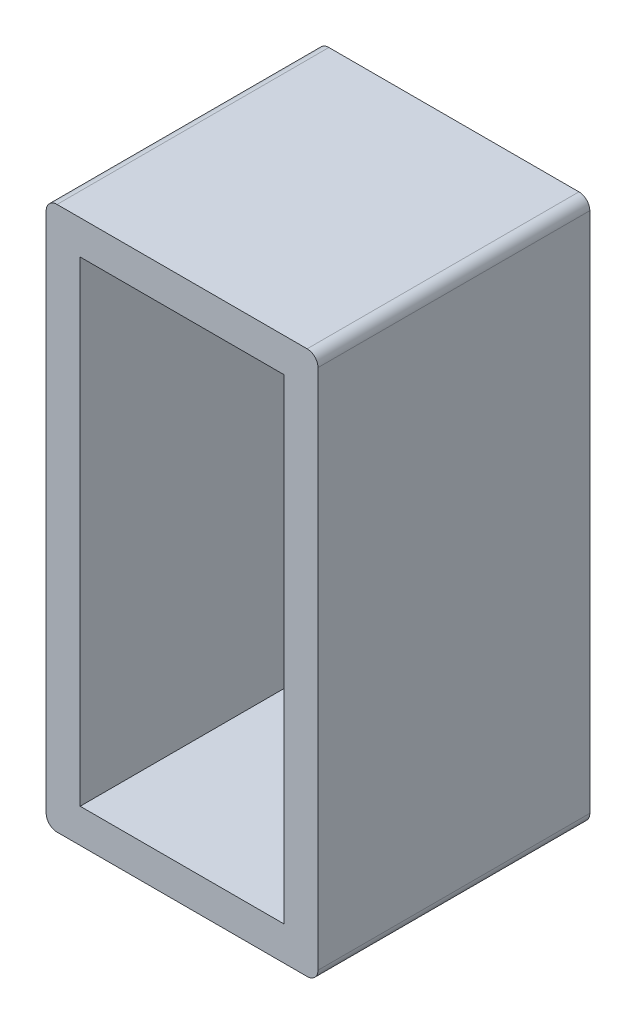
ISO-10303-21;
HEADER;
FILE_DESCRIPTION(('STEP AP214'),'2;1');
FILE_NAME('part.step','',(''),(''),'','','');
FILE_SCHEMA(('AUTOMOTIVE_DESIGN { 1 0 10303 214 1 1 1 1 }'));
ENDSEC;
DATA;
#1=APPLICATION_CONTEXT('core data for automotive mechanical design processes');
#2=APPLICATION_PROTOCOL_DEFINITION('international standard','automotive_design',2000,#1);
#3=PRODUCT_CONTEXT('',#1,'mechanical');
#4=PRODUCT('Part','Part','',(#3));
#5=PRODUCT_RELATED_PRODUCT_CATEGORY('part','',(#4));
#6=PRODUCT_DEFINITION_FORMATION('','',#4);
#7=PRODUCT_DEFINITION_CONTEXT('part definition',#1,'design');
#8=PRODUCT_DEFINITION('design','',#6,#7);
#9=PRODUCT_DEFINITION_SHAPE('','',#8);
#10=(LENGTH_UNIT() NAMED_UNIT(*) SI_UNIT(.MILLI.,.METRE.));
#11=(NAMED_UNIT(*) PLANE_ANGLE_UNIT() SI_UNIT($,.RADIAN.));
#12=(NAMED_UNIT(*) SI_UNIT($,.STERADIAN.) SOLID_ANGLE_UNIT());
#13=UNCERTAINTY_MEASURE_WITH_UNIT(LENGTH_MEASURE(1.E-05),#10,'distance_accuracy_value','');
#14=(GEOMETRIC_REPRESENTATION_CONTEXT(3) GLOBAL_UNCERTAINTY_ASSIGNED_CONTEXT((#13)) GLOBAL_UNIT_ASSIGNED_CONTEXT((#10,
#11,#12)) REPRESENTATION_CONTEXT('',''));
#15=CARTESIAN_POINT('',(0.,0.,0.));
#16=DIRECTION('',(0.,0.,1.));
#17=DIRECTION('',(1.,0.,0.));
#18=AXIS2_PLACEMENT_3D('',#15,#16,#17);
#19=CARTESIAN_POINT('',(-11.684,-24.384,12.7));
#20=DIRECTION('',(0.,0.,1.));
#21=DIRECTION('',(1.,0.,0.));
#22=AXIS2_PLACEMENT_3D('',#19,#20,#21);
#23=PLANE('',#22);
#24=CARTESIAN_POINT('',(-11.684,-24.384,12.7));
#25=DIRECTION('',(0.,0.,1.));
#26=DIRECTION('',(1.,0.,0.));
#27=AXIS2_PLACEMENT_3D('',#24,#25,#26);
#28=CIRCLE('',#27,1.016);
#29=CARTESIAN_POINT('',(-12.7,-24.384,12.7));
#30=VERTEX_POINT('',#29);
#31=CARTESIAN_POINT('',(-11.684,-25.4,12.7));
#32=VERTEX_POINT('',#31);
#33=EDGE_CURVE('E157',#30,#32,#28,.T.);
#34=ORIENTED_EDGE('',*,*,#33,.T.);
#35=DIRECTION('',(1.,0.,0.));
#36=VECTOR('',#35,1.);
#37=CARTESIAN_POINT('',(-11.684,-25.4,12.7));
#38=LINE('',#37,#36);
#39=CARTESIAN_POINT('',(11.684,-25.4,12.7));
#40=VERTEX_POINT('',#39);
#41=EDGE_CURVE('E160',#32,#40,#38,.T.);
#42=ORIENTED_EDGE('',*,*,#41,.T.);
#43=CARTESIAN_POINT('',(11.684,-24.384,12.7));
#44=DIRECTION('',(0.,0.,1.));
#45=DIRECTION('',(1.,0.,0.));
#46=AXIS2_PLACEMENT_3D('',#43,#44,#45);
#47=CIRCLE('',#46,1.016);
#48=CARTESIAN_POINT('',(12.7,-24.384,12.7));
#49=VERTEX_POINT('',#48);
#50=EDGE_CURVE('E163',#40,#49,#47,.T.);
#51=ORIENTED_EDGE('',*,*,#50,.T.);
#52=DIRECTION('',(0.,1.,0.));
#53=VECTOR('',#52,1.);
#54=CARTESIAN_POINT('',(12.7,-24.384,12.7));
#55=LINE('',#54,#53);
#56=CARTESIAN_POINT('',(12.7,24.384,12.7));
#57=VERTEX_POINT('',#56);
#58=EDGE_CURVE('E165',#49,#57,#55,.T.);
#59=ORIENTED_EDGE('',*,*,#58,.T.);
#60=CARTESIAN_POINT('',(11.684,24.384,12.7));
#61=DIRECTION('',(0.,0.,1.));
#62=DIRECTION('',(1.,0.,0.));
#63=AXIS2_PLACEMENT_3D('',#60,#61,#62);
#64=CIRCLE('',#63,1.016);
#65=CARTESIAN_POINT('',(11.684,25.4,12.7));
#66=VERTEX_POINT('',#65);
#67=EDGE_CURVE('E167',#57,#66,#64,.T.);
#68=ORIENTED_EDGE('',*,*,#67,.T.);
#69=DIRECTION('',(-1.,0.,0.));
#70=VECTOR('',#69,1.);
#71=CARTESIAN_POINT('',(-11.684,25.4,12.7));
#72=LINE('',#71,#70);
#73=CARTESIAN_POINT('',(-11.684,25.4,12.7));
#74=VERTEX_POINT('',#73);
#75=EDGE_CURVE('E169',#66,#74,#72,.T.);
#76=ORIENTED_EDGE('',*,*,#75,.T.);
#77=CARTESIAN_POINT('',(-11.684,24.384,12.7));
#78=DIRECTION('',(0.,0.,1.));
#79=DIRECTION('',(1.,0.,0.));
#80=AXIS2_PLACEMENT_3D('',#77,#78,#79);
#81=CIRCLE('',#80,1.016);
#82=CARTESIAN_POINT('',(-12.7,24.384,12.7));
#83=VERTEX_POINT('',#82);
#84=EDGE_CURVE('E171',#74,#83,#81,.T.);
#85=ORIENTED_EDGE('',*,*,#84,.T.);
#86=DIRECTION('',(0.,-1.,0.));
#87=VECTOR('',#86,1.);
#88=CARTESIAN_POINT('',(-12.7,-24.384,12.7));
#89=LINE('',#88,#87);
#90=EDGE_CURVE('E173',#83,#30,#89,.T.);
#91=ORIENTED_EDGE('',*,*,#90,.T.);
#92=EDGE_LOOP('',(#34,#42,#51,#59,#68,#76,#85,#91));
#93=FACE_BOUND('',#92,.T.);
#94=DIRECTION('',(1.,0.,0.));
#95=VECTOR('',#94,1.);
#96=CARTESIAN_POINT('',(-9.525,-22.225,12.7));
#97=LINE('',#96,#95);
#98=CARTESIAN_POINT('',(-9.525,-22.225,12.7));
#99=VERTEX_POINT('',#98);
#100=CARTESIAN_POINT('',(9.525,-22.225,12.7));
#101=VERTEX_POINT('',#100);
#102=EDGE_CURVE('E129',#99,#101,#97,.T.);
#103=ORIENTED_EDGE('',*,*,#102,.F.);
#104=DIRECTION('',(0.,-1.,0.));
#105=VECTOR('',#104,1.);
#106=CARTESIAN_POINT('',(-9.525,-22.225,12.7));
#107=LINE('',#106,#105);
#108=CARTESIAN_POINT('',(-9.525,22.225,12.7));
#109=VERTEX_POINT('',#108);
#110=EDGE_CURVE('E121',#109,#99,#107,.T.);
#111=ORIENTED_EDGE('',*,*,#110,.F.);
#112=DIRECTION('',(-1.,0.,0.));
#113=VECTOR('',#112,1.);
#114=CARTESIAN_POINT('',(-9.525,22.225,12.7));
#115=LINE('',#114,#113);
#116=CARTESIAN_POINT('',(9.525,22.225,12.7));
#117=VERTEX_POINT('',#116);
#118=EDGE_CURVE('E143',#117,#109,#115,.T.);
#119=ORIENTED_EDGE('',*,*,#118,.F.);
#120=DIRECTION('',(0.,1.,0.));
#121=VECTOR('',#120,1.);
#122=CARTESIAN_POINT('',(9.525,-22.225,12.7));
#123=LINE('',#122,#121);
#124=EDGE_CURVE('E141',#101,#117,#123,.T.);
#125=ORIENTED_EDGE('',*,*,#124,.F.);
#126=EDGE_LOOP('',(#103,#111,#119,#125));
#127=FACE_BOUND('',#126,.T.);
#128=ADVANCED_FACE('F32',(#93,#127),#23,.T.);
#129=CARTESIAN_POINT('',(-11.684,-24.384,-12.7));
#130=DIRECTION('',(0.,0.,1.));
#131=DIRECTION('',(1.,0.,0.));
#132=AXIS2_PLACEMENT_3D('',#129,#130,#131);
#133=PLANE('',#132);
#134=CARTESIAN_POINT('',(-11.684,-24.384,-12.7));
#135=DIRECTION('',(0.,0.,1.));
#136=DIRECTION('',(1.,0.,0.));
#137=AXIS2_PLACEMENT_3D('',#134,#135,#136);
#138=CIRCLE('',#137,1.016);
#139=CARTESIAN_POINT('',(-12.7,-24.384,-12.7));
#140=VERTEX_POINT('',#139);
#141=CARTESIAN_POINT('',(-11.684,-25.4,-12.7));
#142=VERTEX_POINT('',#141);
#143=EDGE_CURVE('E137',#140,#142,#138,.T.);
#144=ORIENTED_EDGE('',*,*,#143,.F.);
#145=DIRECTION('',(0.,-1.,0.));
#146=VECTOR('',#145,1.);
#147=CARTESIAN_POINT('',(-12.7,-24.384,-12.7));
#148=LINE('',#147,#146);
#149=CARTESIAN_POINT('',(-12.7,24.384,-12.7));
#150=VERTEX_POINT('',#149);
#151=EDGE_CURVE('E161',#150,#140,#148,.T.);
#152=ORIENTED_EDGE('',*,*,#151,.F.);
#153=CARTESIAN_POINT('',(-11.684,24.384,-12.7));
#154=DIRECTION('',(0.,0.,1.));
#155=DIRECTION('',(1.,0.,0.));
#156=AXIS2_PLACEMENT_3D('',#153,#154,#155);
#157=CIRCLE('',#156,1.016);
#158=CARTESIAN_POINT('',(-11.684,25.4,-12.7));
#159=VERTEX_POINT('',#158);
#160=EDGE_CURVE('E188',#159,#150,#157,.T.);
#161=ORIENTED_EDGE('',*,*,#160,.F.);
#162=DIRECTION('',(-1.,0.,0.));
#163=VECTOR('',#162,1.);
#164=CARTESIAN_POINT('',(-11.684,25.4,-12.7));
#165=LINE('',#164,#163);
#166=CARTESIAN_POINT('',(11.684,25.4,-12.7));
#167=VERTEX_POINT('',#166);
#168=EDGE_CURVE('E186',#167,#159,#165,.T.);
#169=ORIENTED_EDGE('',*,*,#168,.F.);
#170=CARTESIAN_POINT('',(11.684,24.384,-12.7));
#171=DIRECTION('',(0.,0.,1.));
#172=DIRECTION('',(1.,0.,0.));
#173=AXIS2_PLACEMENT_3D('',#170,#171,#172);
#174=CIRCLE('',#173,1.016);
#175=CARTESIAN_POINT('',(12.7,24.384,-12.7));
#176=VERTEX_POINT('',#175);
#177=EDGE_CURVE('E184',#176,#167,#174,.T.);
#178=ORIENTED_EDGE('',*,*,#177,.F.);
#179=DIRECTION('',(0.,1.,0.));
#180=VECTOR('',#179,1.);
#181=CARTESIAN_POINT('',(12.7,-24.384,-12.7));
#182=LINE('',#181,#180);
#183=CARTESIAN_POINT('',(12.7,-24.384,-12.7));
#184=VERTEX_POINT('',#183);
#185=EDGE_CURVE('E182',#184,#176,#182,.T.);
#186=ORIENTED_EDGE('',*,*,#185,.F.);
#187=CARTESIAN_POINT('',(11.684,-24.384,-12.7));
#188=DIRECTION('',(0.,0.,1.));
#189=DIRECTION('',(1.,0.,0.));
#190=AXIS2_PLACEMENT_3D('',#187,#188,#189);
#191=CIRCLE('',#190,1.016);
#192=CARTESIAN_POINT('',(11.684,-25.4,-12.7));
#193=VERTEX_POINT('',#192);
#194=EDGE_CURVE('E180',#193,#184,#191,.T.);
#195=ORIENTED_EDGE('',*,*,#194,.F.);
#196=DIRECTION('',(1.,0.,0.));
#197=VECTOR('',#196,1.);
#198=CARTESIAN_POINT('',(-11.684,-25.4,-12.7));
#199=LINE('',#198,#197);
#200=EDGE_CURVE('E178',#142,#193,#199,.T.);
#201=ORIENTED_EDGE('',*,*,#200,.F.);
#202=EDGE_LOOP('',(#144,#152,#161,#169,#178,#186,#195,#201));
#203=FACE_BOUND('',#202,.T.);
#204=DIRECTION('',(0.,-1.,0.));
#205=VECTOR('',#204,1.);
#206=CARTESIAN_POINT('',(-9.525,-22.225,-12.7));
#207=LINE('',#206,#205);
#208=CARTESIAN_POINT('',(-9.525,22.225,-12.7));
#209=VERTEX_POINT('',#208);
#210=CARTESIAN_POINT('',(-9.525,-22.225,-12.7));
#211=VERTEX_POINT('',#210);
#212=EDGE_CURVE('E55',#209,#211,#207,.T.);
#213=ORIENTED_EDGE('',*,*,#212,.T.);
#214=DIRECTION('',(1.,0.,0.));
#215=VECTOR('',#214,1.);
#216=CARTESIAN_POINT('',(-9.525,-22.225,-12.7));
#217=LINE('',#216,#215);
#218=CARTESIAN_POINT('',(9.525,-22.225,-12.7));
#219=VERTEX_POINT('',#218);
#220=EDGE_CURVE('E136',#211,#219,#217,.T.);
#221=ORIENTED_EDGE('',*,*,#220,.T.);
#222=DIRECTION('',(0.,1.,0.));
#223=VECTOR('',#222,1.);
#224=CARTESIAN_POINT('',(9.525,-22.225,-12.7));
#225=LINE('',#224,#223);
#226=CARTESIAN_POINT('',(9.525,22.225,-12.7));
#227=VERTEX_POINT('',#226);
#228=EDGE_CURVE('E149',#219,#227,#225,.T.);
#229=ORIENTED_EDGE('',*,*,#228,.T.);
#230=DIRECTION('',(-1.,0.,0.));
#231=VECTOR('',#230,1.);
#232=CARTESIAN_POINT('',(-9.525,22.225,-12.7));
#233=LINE('',#232,#231);
#234=EDGE_CURVE('E130',#227,#209,#233,.T.);
#235=ORIENTED_EDGE('',*,*,#234,.T.);
#236=EDGE_LOOP('',(#213,#221,#229,#235));
#237=FACE_BOUND('',#236,.T.);
#238=ADVANCED_FACE('F218',(#203,#237),#133,.F.);
#239=CARTESIAN_POINT('',(-11.684,-24.384,12.7));
#240=DIRECTION('',(0.,0.,-1.));
#241=DIRECTION('',(-1.,0.,0.));
#242=AXIS2_PLACEMENT_3D('',#239,#240,#241);
#243=CYLINDRICAL_SURFACE('',#242,1.016);
#244=ORIENTED_EDGE('',*,*,#143,.T.);
#245=DIRECTION('',(0.,0.,-1.));
#246=VECTOR('',#245,1.);
#247=CARTESIAN_POINT('',(-11.684,-25.4,12.7));
#248=LINE('',#247,#246);
#249=EDGE_CURVE('E11',#32,#142,#248,.T.);
#250=ORIENTED_EDGE('',*,*,#249,.F.);
#251=ORIENTED_EDGE('',*,*,#33,.F.);
#252=DIRECTION('',(0.,0.,-1.));
#253=VECTOR('',#252,1.);
#254=CARTESIAN_POINT('',(-12.7,-24.384,12.7));
#255=LINE('',#254,#253);
#256=EDGE_CURVE('E175',#30,#140,#255,.T.);
#257=ORIENTED_EDGE('',*,*,#256,.T.);
#258=EDGE_LOOP('',(#244,#250,#251,#257));
#259=FACE_BOUND('',#258,.T.);
#260=ADVANCED_FACE('F34',(#259),#243,.T.);
#261=CARTESIAN_POINT('',(-11.684,-25.4,12.7));
#262=DIRECTION('',(0.,1.,0.));
#263=DIRECTION('',(0.,0.,1.));
#264=AXIS2_PLACEMENT_3D('',#261,#262,#263);
#265=PLANE('',#264);
#266=ORIENTED_EDGE('',*,*,#200,.T.);
#267=DIRECTION('',(0.,0.,-1.));
#268=VECTOR('',#267,1.);
#269=CARTESIAN_POINT('',(11.684,-25.4,12.7));
#270=LINE('',#269,#268);
#271=EDGE_CURVE('E40',#40,#193,#270,.T.);
#272=ORIENTED_EDGE('',*,*,#271,.F.);
#273=ORIENTED_EDGE('',*,*,#41,.F.);
#274=ORIENTED_EDGE('',*,*,#249,.T.);
#275=EDGE_LOOP('',(#266,#272,#273,#274));
#276=FACE_BOUND('',#275,.T.);
#277=ADVANCED_FACE('F235',(#276),#265,.F.);
#278=CARTESIAN_POINT('',(11.684,-24.384,12.7));
#279=DIRECTION('',(0.,0.,-1.));
#280=DIRECTION('',(-1.,0.,0.));
#281=AXIS2_PLACEMENT_3D('',#278,#279,#280);
#282=CYLINDRICAL_SURFACE('',#281,1.016);
#283=ORIENTED_EDGE('',*,*,#194,.T.);
#284=DIRECTION('',(0.,0.,-1.));
#285=VECTOR('',#284,1.);
#286=CARTESIAN_POINT('',(12.7,-24.384,12.7));
#287=LINE('',#286,#285);
#288=EDGE_CURVE('E205',#49,#184,#287,.T.);
#289=ORIENTED_EDGE('',*,*,#288,.F.);
#290=ORIENTED_EDGE('',*,*,#50,.F.);
#291=ORIENTED_EDGE('',*,*,#271,.T.);
#292=EDGE_LOOP('',(#283,#289,#290,#291));
#293=FACE_BOUND('',#292,.T.);
#294=ADVANCED_FACE('F212',(#293),#282,.T.);
#295=CARTESIAN_POINT('',(12.7,-24.384,12.7));
#296=DIRECTION('',(-1.,0.,0.));
#297=DIRECTION('',(0.,0.,1.));
#298=AXIS2_PLACEMENT_3D('',#295,#296,#297);
#299=PLANE('',#298);
#300=ORIENTED_EDGE('',*,*,#185,.T.);
#301=DIRECTION('',(0.,0.,-1.));
#302=VECTOR('',#301,1.);
#303=CARTESIAN_POINT('',(12.7,24.384,12.7));
#304=LINE('',#303,#302);
#305=EDGE_CURVE('E202',#57,#176,#304,.T.);
#306=ORIENTED_EDGE('',*,*,#305,.F.);
#307=ORIENTED_EDGE('',*,*,#58,.F.);
#308=ORIENTED_EDGE('',*,*,#288,.T.);
#309=EDGE_LOOP('',(#300,#306,#307,#308));
#310=FACE_BOUND('',#309,.T.);
#311=ADVANCED_FACE('F224',(#310),#299,.F.);
#312=CARTESIAN_POINT('',(11.684,24.384,12.7));
#313=DIRECTION('',(0.,0.,-1.));
#314=DIRECTION('',(-1.,0.,0.));
#315=AXIS2_PLACEMENT_3D('',#312,#313,#314);
#316=CYLINDRICAL_SURFACE('',#315,1.016);
#317=ORIENTED_EDGE('',*,*,#177,.T.);
#318=DIRECTION('',(0.,0.,-1.));
#319=VECTOR('',#318,1.);
#320=CARTESIAN_POINT('',(11.684,25.4,12.7));
#321=LINE('',#320,#319);
#322=EDGE_CURVE('E199',#66,#167,#321,.T.);
#323=ORIENTED_EDGE('',*,*,#322,.F.);
#324=ORIENTED_EDGE('',*,*,#67,.F.);
#325=ORIENTED_EDGE('',*,*,#305,.T.);
#326=EDGE_LOOP('',(#317,#323,#324,#325));
#327=FACE_BOUND('',#326,.T.);
#328=ADVANCED_FACE('F228',(#327),#316,.T.);
#329=CARTESIAN_POINT('',(-11.684,25.4,12.7));
#330=DIRECTION('',(0.,-1.,0.));
#331=DIRECTION('',(0.,0.,-1.));
#332=AXIS2_PLACEMENT_3D('',#329,#330,#331);
#333=PLANE('',#332);
#334=ORIENTED_EDGE('',*,*,#168,.T.);
#335=DIRECTION('',(0.,0.,-1.));
#336=VECTOR('',#335,1.);
#337=CARTESIAN_POINT('',(-11.684,25.4,12.7));
#338=LINE('',#337,#336);
#339=EDGE_CURVE('E196',#74,#159,#338,.T.);
#340=ORIENTED_EDGE('',*,*,#339,.F.);
#341=ORIENTED_EDGE('',*,*,#75,.F.);
#342=ORIENTED_EDGE('',*,*,#322,.T.);
#343=EDGE_LOOP('',(#334,#340,#341,#342));
#344=FACE_BOUND('',#343,.T.);
#345=ADVANCED_FACE('F248',(#344),#333,.F.);
#346=CARTESIAN_POINT('',(-11.684,24.384,12.7));
#347=DIRECTION('',(0.,0.,-1.));
#348=DIRECTION('',(-1.,0.,0.));
#349=AXIS2_PLACEMENT_3D('',#346,#347,#348);
#350=CYLINDRICAL_SURFACE('',#349,1.016);
#351=ORIENTED_EDGE('',*,*,#160,.T.);
#352=DIRECTION('',(0.,0.,-1.));
#353=VECTOR('',#352,1.);
#354=CARTESIAN_POINT('',(-12.7,24.384,12.7));
#355=LINE('',#354,#353);
#356=EDGE_CURVE('E193',#83,#150,#355,.T.);
#357=ORIENTED_EDGE('',*,*,#356,.F.);
#358=ORIENTED_EDGE('',*,*,#84,.F.);
#359=ORIENTED_EDGE('',*,*,#339,.T.);
#360=EDGE_LOOP('',(#351,#357,#358,#359));
#361=FACE_BOUND('',#360,.T.);
#362=ADVANCED_FACE('F246',(#361),#350,.T.);
#363=CARTESIAN_POINT('',(-12.7,-24.384,12.7));
#364=DIRECTION('',(1.,0.,0.));
#365=DIRECTION('',(0.,0.,-1.));
#366=AXIS2_PLACEMENT_3D('',#363,#364,#365);
#367=PLANE('',#366);
#368=ORIENTED_EDGE('',*,*,#151,.T.);
#369=ORIENTED_EDGE('',*,*,#256,.F.);
#370=ORIENTED_EDGE('',*,*,#90,.F.);
#371=ORIENTED_EDGE('',*,*,#356,.T.);
#372=EDGE_LOOP('',(#368,#369,#370,#371));
#373=FACE_BOUND('',#372,.T.);
#374=ADVANCED_FACE('F241',(#373),#367,.F.);
#375=CARTESIAN_POINT('',(-9.525,-22.225,12.7));
#376=DIRECTION('',(1.,0.,0.));
#377=DIRECTION('',(0.,0.,-1.));
#378=AXIS2_PLACEMENT_3D('',#375,#376,#377);
#379=PLANE('',#378);
#380=ORIENTED_EDGE('',*,*,#212,.F.);
#381=DIRECTION('',(0.,0.,-1.));
#382=VECTOR('',#381,1.);
#383=CARTESIAN_POINT('',(-9.525,22.225,12.7));
#384=LINE('',#383,#382);
#385=EDGE_CURVE('E125',#109,#209,#384,.T.);
#386=ORIENTED_EDGE('',*,*,#385,.F.);
#387=ORIENTED_EDGE('',*,*,#110,.T.);
#388=DIRECTION('',(0.,0.,-1.));
#389=VECTOR('',#388,1.);
#390=CARTESIAN_POINT('',(-9.525,-22.225,12.7));
#391=LINE('',#390,#389);
#392=EDGE_CURVE('E124',#99,#211,#391,.T.);
#393=ORIENTED_EDGE('',*,*,#392,.T.);
#394=EDGE_LOOP('',(#380,#386,#387,#393));
#395=FACE_BOUND('',#394,.T.);
#396=ADVANCED_FACE('F123',(#395),#379,.T.);
#397=CARTESIAN_POINT('',(-9.525,-22.225,12.7));
#398=DIRECTION('',(0.,1.,0.));
#399=DIRECTION('',(0.,0.,1.));
#400=AXIS2_PLACEMENT_3D('',#397,#398,#399);
#401=PLANE('',#400);
#402=ORIENTED_EDGE('',*,*,#220,.F.);
#403=ORIENTED_EDGE('',*,*,#392,.F.);
#404=ORIENTED_EDGE('',*,*,#102,.T.);
#405=DIRECTION('',(0.,0.,-1.));
#406=VECTOR('',#405,1.);
#407=CARTESIAN_POINT('',(9.525,-22.225,12.7));
#408=LINE('',#407,#406);
#409=EDGE_CURVE('E138',#101,#219,#408,.T.);
#410=ORIENTED_EDGE('',*,*,#409,.T.);
#411=EDGE_LOOP('',(#402,#403,#404,#410));
#412=FACE_BOUND('',#411,.T.);
#413=ADVANCED_FACE('F133',(#412),#401,.T.);
#414=CARTESIAN_POINT('',(9.525,-22.225,12.7));
#415=DIRECTION('',(-1.,0.,0.));
#416=DIRECTION('',(0.,-1.,0.));
#417=AXIS2_PLACEMENT_3D('',#414,#415,#416);
#418=PLANE('',#417);
#419=ORIENTED_EDGE('',*,*,#228,.F.);
#420=ORIENTED_EDGE('',*,*,#409,.F.);
#421=ORIENTED_EDGE('',*,*,#124,.T.);
#422=DIRECTION('',(0.,0.,-1.));
#423=VECTOR('',#422,1.);
#424=CARTESIAN_POINT('',(9.525,22.225,12.7));
#425=LINE('',#424,#423);
#426=EDGE_CURVE('E47',#117,#227,#425,.T.);
#427=ORIENTED_EDGE('',*,*,#426,.T.);
#428=EDGE_LOOP('',(#419,#420,#421,#427));
#429=FACE_BOUND('',#428,.T.);
#430=ADVANCED_FACE('F273',(#429),#418,.T.);
#431=CARTESIAN_POINT('',(-9.525,22.225,12.7));
#432=DIRECTION('',(0.,-1.,0.));
#433=DIRECTION('',(1.,0.,0.));
#434=AXIS2_PLACEMENT_3D('',#431,#432,#433);
#435=PLANE('',#434);
#436=ORIENTED_EDGE('',*,*,#234,.F.);
#437=ORIENTED_EDGE('',*,*,#426,.F.);
#438=ORIENTED_EDGE('',*,*,#118,.T.);
#439=ORIENTED_EDGE('',*,*,#385,.T.);
#440=EDGE_LOOP('',(#436,#437,#438,#439));
#441=FACE_BOUND('',#440,.T.);
#442=ADVANCED_FACE('F277',(#441),#435,.T.);
#443=CLOSED_SHELL('',(#128,#238,#260,#277,#294,#311,#328,#345,#362,#374,#396,#413,#430,#442));
#444=MANIFOLD_SOLID_BREP('B2',#443);
#445=ADVANCED_BREP_SHAPE_REPRESENTATION('',(#18,#444),#14);
#446=SHAPE_DEFINITION_REPRESENTATION(#9,#445);
ENDSEC;
END-ISO-10303-21;
